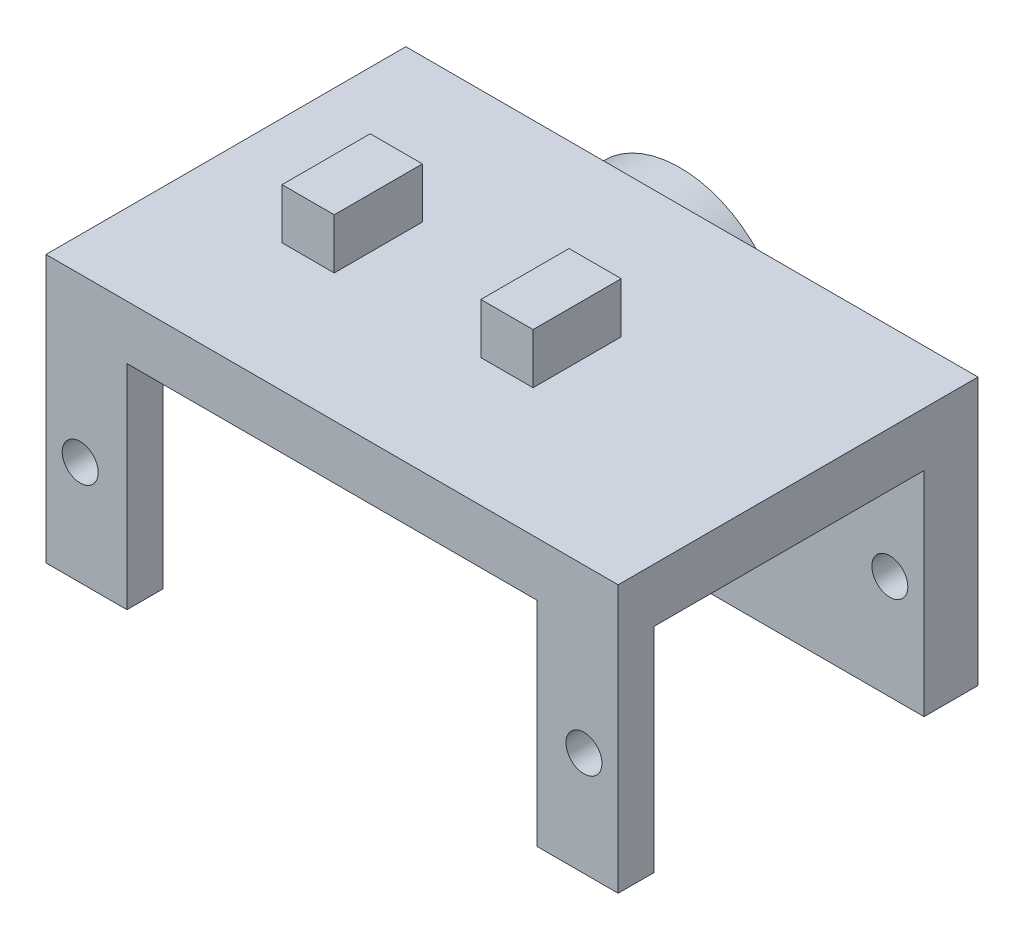
ISO-10303-21;
HEADER;
FILE_DESCRIPTION(('STEP AP214'),'2;1');
FILE_NAME('part.step','',(''),(''),'','','');
FILE_SCHEMA(('AUTOMOTIVE_DESIGN { 1 0 10303 214 1 1 1 1 }'));
ENDSEC;
DATA;
#1=APPLICATION_CONTEXT('core data for automotive mechanical design processes');
#2=APPLICATION_PROTOCOL_DEFINITION('international standard','automotive_design',2000,#1);
#3=PRODUCT_CONTEXT('',#1,'mechanical');
#4=PRODUCT('Part','Part','',(#3));
#5=PRODUCT_RELATED_PRODUCT_CATEGORY('part','',(#4));
#6=PRODUCT_DEFINITION_FORMATION('','',#4);
#7=PRODUCT_DEFINITION_CONTEXT('part definition',#1,'design');
#8=PRODUCT_DEFINITION('design','',#6,#7);
#9=PRODUCT_DEFINITION_SHAPE('','',#8);
#10=(LENGTH_UNIT() NAMED_UNIT(*) SI_UNIT(.MILLI.,.METRE.));
#11=(NAMED_UNIT(*) PLANE_ANGLE_UNIT() SI_UNIT($,.RADIAN.));
#12=(NAMED_UNIT(*) SI_UNIT($,.STERADIAN.) SOLID_ANGLE_UNIT());
#13=UNCERTAINTY_MEASURE_WITH_UNIT(LENGTH_MEASURE(1.E-05),#10,'distance_accuracy_value','');
#14=(GEOMETRIC_REPRESENTATION_CONTEXT(3) GLOBAL_UNCERTAINTY_ASSIGNED_CONTEXT((#13)) GLOBAL_UNIT_ASSIGNED_CONTEXT((#10,
#11,#12)) REPRESENTATION_CONTEXT('',''));
#15=CARTESIAN_POINT('',(0.,0.,0.));
#16=DIRECTION('',(0.,0.,1.));
#17=DIRECTION('',(1.,0.,0.));
#18=AXIS2_PLACEMENT_3D('',#15,#16,#17);
#19=CARTESIAN_POINT('',(-15.9,9.625,-21.));
#20=DIRECTION('',(0.,1.,0.));
#21=DIRECTION('',(0.,0.,1.));
#22=AXIS2_PLACEMENT_3D('',#19,#20,#21);
#23=PLANE('',#22);
#24=DIRECTION('',(-1.,0.,0.));
#25=VECTOR('',#24,1.);
#26=CARTESIAN_POINT('',(84.1,9.625,1.6));
#27=LINE('',#26,#25);
#28=CARTESIAN_POINT('',(15.9,9.625,1.6));
#29=VERTEX_POINT('',#28);
#30=CARTESIAN_POINT('',(-15.9,9.625,1.6));
#31=VERTEX_POINT('',#30);
#32=EDGE_CURVE('E297',#29,#31,#27,.T.);
#33=ORIENTED_EDGE('',*,*,#32,.F.);
#34=DIRECTION('',(0.,0.,1.));
#35=VECTOR('',#34,1.);
#36=CARTESIAN_POINT('',(15.9,9.625,-21.));
#37=LINE('',#36,#35);
#38=CARTESIAN_POINT('',(15.9,9.625,-18.4));
#39=VERTEX_POINT('',#38);
#40=EDGE_CURVE('E346',#39,#29,#37,.T.);
#41=ORIENTED_EDGE('',*,*,#40,.F.);
#42=DIRECTION('',(-1.,0.,0.));
#43=VECTOR('',#42,1.);
#44=CARTESIAN_POINT('',(-15.9,9.625,-18.4));
#45=LINE('',#44,#43);
#46=CARTESIAN_POINT('',(-15.9,9.625,-18.4));
#47=VERTEX_POINT('',#46);
#48=EDGE_CURVE('E322',#39,#47,#45,.T.);
#49=ORIENTED_EDGE('',*,*,#48,.T.);
#50=DIRECTION('',(0.,0.,1.));
#51=VECTOR('',#50,1.);
#52=CARTESIAN_POINT('',(-15.9,9.625,-21.));
#53=LINE('',#52,#51);
#54=EDGE_CURVE('E343',#47,#31,#53,.T.);
#55=ORIENTED_EDGE('',*,*,#54,.T.);
#56=EDGE_LOOP('',(#33,#41,#49,#55));
#57=FACE_BOUND('',#56,.T.);
#58=DIRECTION('',(-1.,0.,0.));
#59=VECTOR('',#58,1.);
#60=CARTESIAN_POINT('',(-9.9,9.625,-10.42));
#61=LINE('',#60,#59);
#62=CARTESIAN_POINT('',(-7.,9.625,-10.42));
#63=VERTEX_POINT('',#62);
#64=CARTESIAN_POINT('',(-9.9,9.625,-10.42));
#65=VERTEX_POINT('',#64);
#66=EDGE_CURVE('E207',#63,#65,#61,.T.);
#67=ORIENTED_EDGE('',*,*,#66,.F.);
#68=DIRECTION('',(0.,0.,-1.));
#69=VECTOR('',#68,1.);
#70=CARTESIAN_POINT('',(-7.,9.625,-10.42));
#71=LINE('',#70,#69);
#72=CARTESIAN_POINT('',(-7.,9.625,-5.52));
#73=VERTEX_POINT('',#72);
#74=EDGE_CURVE('E204',#73,#63,#71,.T.);
#75=ORIENTED_EDGE('',*,*,#74,.F.);
#76=DIRECTION('',(1.,0.,0.));
#77=VECTOR('',#76,1.);
#78=CARTESIAN_POINT('',(-9.9,9.625,-5.52));
#79=LINE('',#78,#77);
#80=CARTESIAN_POINT('',(-9.9,9.625,-5.52));
#81=VERTEX_POINT('',#80);
#82=EDGE_CURVE('E216',#81,#73,#79,.T.);
#83=ORIENTED_EDGE('',*,*,#82,.F.);
#84=DIRECTION('',(0.,0.,1.));
#85=VECTOR('',#84,1.);
#86=CARTESIAN_POINT('',(-9.9,9.625,-10.42));
#87=LINE('',#86,#85);
#88=EDGE_CURVE('E224',#65,#81,#87,.T.);
#89=ORIENTED_EDGE('',*,*,#88,.F.);
#90=EDGE_LOOP('',(#67,#75,#83,#89));
#91=FACE_BOUND('',#90,.T.);
#92=DIRECTION('',(-1.,0.,0.));
#93=VECTOR('',#92,1.);
#94=CARTESIAN_POINT('',(1.15,9.625,-10.42));
#95=LINE('',#94,#93);
#96=CARTESIAN_POINT('',(4.05,9.625,-10.42));
#97=VERTEX_POINT('',#96);
#98=CARTESIAN_POINT('',(1.15,9.625,-10.42));
#99=VERTEX_POINT('',#98);
#100=EDGE_CURVE('E647',#97,#99,#95,.T.);
#101=ORIENTED_EDGE('',*,*,#100,.F.);
#102=DIRECTION('',(0.,0.,-1.));
#103=VECTOR('',#102,1.);
#104=CARTESIAN_POINT('',(4.05,9.625,-5.52));
#105=LINE('',#104,#103);
#106=CARTESIAN_POINT('',(4.05,9.625,-5.52));
#107=VERTEX_POINT('',#106);
#108=EDGE_CURVE('E202',#107,#97,#105,.T.);
#109=ORIENTED_EDGE('',*,*,#108,.F.);
#110=DIRECTION('',(1.,0.,0.));
#111=VECTOR('',#110,1.);
#112=CARTESIAN_POINT('',(1.15,9.625,-5.52));
#113=LINE('',#112,#111);
#114=CARTESIAN_POINT('',(1.15,9.625,-5.52));
#115=VERTEX_POINT('',#114);
#116=EDGE_CURVE('E198',#115,#107,#113,.T.);
#117=ORIENTED_EDGE('',*,*,#116,.F.);
#118=DIRECTION('',(0.,0.,1.));
#119=VECTOR('',#118,1.);
#120=CARTESIAN_POINT('',(1.15,9.625,-5.52));
#121=LINE('',#120,#119);
#122=EDGE_CURVE('E644',#99,#115,#121,.T.);
#123=ORIENTED_EDGE('',*,*,#122,.F.);
#124=EDGE_LOOP('',(#101,#109,#117,#123));
#125=FACE_BOUND('',#124,.T.);
#126=ADVANCED_FACE('F37',(#57,#91,#125),#23,.T.);
#127=CARTESIAN_POINT('',(14.,0.574999999999999,-18.4));
#128=DIRECTION('',(0.,0.,1.));
#129=DIRECTION('',(1.,0.,0.));
#130=AXIS2_PLACEMENT_3D('',#127,#128,#129);
#131=CYLINDRICAL_SURFACE('',#130,1.);
#132=CARTESIAN_POINT('',(14.,0.574999999999999,-15.4));
#133=DIRECTION('',(0.,0.,1.));
#134=DIRECTION('',(1.,0.,0.));
#135=AXIS2_PLACEMENT_3D('',#132,#133,#134);
#136=CIRCLE('',#135,1.);
#137=CARTESIAN_POINT('',(15.,0.574999999999999,-15.4));
#138=VERTEX_POINT('',#137);
#139=EDGE_CURVE('E271',#138,#138,#136,.T.);
#140=ORIENTED_EDGE('',*,*,#139,.T.);
#141=EDGE_LOOP('',(#140));
#142=FACE_BOUND('',#141,.T.);
#143=CARTESIAN_POINT('',(14.,0.574999999999999,-18.4));
#144=DIRECTION('',(0.,0.,1.));
#145=DIRECTION('',(-1.,0.,0.));
#146=AXIS2_PLACEMENT_3D('',#143,#144,#145);
#147=CIRCLE('',#146,1.);
#148=CARTESIAN_POINT('',(13.,0.574999999999999,-18.4));
#149=VERTEX_POINT('',#148);
#150=EDGE_CURVE('E264',#149,#149,#147,.T.);
#151=ORIENTED_EDGE('',*,*,#150,.F.);
#152=EDGE_LOOP('',(#151));
#153=FACE_BOUND('',#152,.T.);
#154=ADVANCED_FACE('F430',(#142,#153),#131,.F.);
#155=CARTESIAN_POINT('',(11.4,0.,0.));
#156=DIRECTION('',(1.,0.,0.));
#157=DIRECTION('',(0.,0.,-1.));
#158=AXIS2_PLACEMENT_3D('',#155,#156,#157);
#159=PLANE('',#158);
#160=DIRECTION('',(0.,-1.,0.));
#161=VECTOR('',#160,1.);
#162=CARTESIAN_POINT('',(11.4,0.,-0.4));
#163=LINE('',#162,#161);
#164=CARTESIAN_POINT('',(11.4,6.625,-0.400000000000001));
#165=VERTEX_POINT('',#164);
#166=CARTESIAN_POINT('',(11.4,-5.225,-0.4));
#167=VERTEX_POINT('',#166);
#168=EDGE_CURVE('E319',#165,#167,#163,.T.);
#169=ORIENTED_EDGE('',*,*,#168,.T.);
#170=DIRECTION('',(0.,0.,1.));
#171=VECTOR('',#170,1.);
#172=CARTESIAN_POINT('',(11.4,-5.225,0.));
#173=LINE('',#172,#171);
#174=CARTESIAN_POINT('',(11.4,-5.225,1.6));
#175=VERTEX_POINT('',#174);
#176=EDGE_CURVE('E283',#167,#175,#173,.T.);
#177=ORIENTED_EDGE('',*,*,#176,.T.);
#178=DIRECTION('',(0.,1.,0.));
#179=VECTOR('',#178,1.);
#180=CARTESIAN_POINT('',(11.4,0.,1.6));
#181=LINE('',#180,#179);
#182=CARTESIAN_POINT('',(11.4,6.625,1.6));
#183=VERTEX_POINT('',#182);
#184=EDGE_CURVE('E309',#175,#183,#181,.T.);
#185=ORIENTED_EDGE('',*,*,#184,.T.);
#186=DIRECTION('',(0.,0.,1.));
#187=VECTOR('',#186,1.);
#188=CARTESIAN_POINT('',(11.4,6.625,0.));
#189=LINE('',#188,#187);
#190=EDGE_CURVE('E336',#165,#183,#189,.T.);
#191=ORIENTED_EDGE('',*,*,#190,.F.);
#192=EDGE_LOOP('',(#169,#177,#185,#191));
#193=FACE_BOUND('',#192,.T.);
#194=ADVANCED_FACE('F407',(#193),#159,.F.);
#195=CARTESIAN_POINT('',(-15.9,6.625,-21.));
#196=DIRECTION('',(0.,-1.,0.));
#197=DIRECTION('',(0.,0.,-1.));
#198=AXIS2_PLACEMENT_3D('',#195,#196,#197);
#199=PLANE('',#198);
#200=DIRECTION('',(-1.,0.,0.));
#201=VECTOR('',#200,1.);
#202=CARTESIAN_POINT('',(84.1,6.625,-0.400000000000001));
#203=LINE('',#202,#201);
#204=CARTESIAN_POINT('',(15.9,6.625,-0.400000000000001));
#205=VERTEX_POINT('',#204);
#206=EDGE_CURVE('E300',#205,#165,#203,.T.);
#207=ORIENTED_EDGE('',*,*,#206,.T.);
#208=ORIENTED_EDGE('',*,*,#190,.T.);
#209=DIRECTION('',(1.,0.,0.));
#210=VECTOR('',#209,1.);
#211=CARTESIAN_POINT('',(-15.9,6.625,1.6));
#212=LINE('',#211,#210);
#213=CARTESIAN_POINT('',(-11.4,6.625,1.6));
#214=VERTEX_POINT('',#213);
#215=EDGE_CURVE('E306',#214,#183,#212,.T.);
#216=ORIENTED_EDGE('',*,*,#215,.F.);
#217=DIRECTION('',(0.,0.,1.));
#218=VECTOR('',#217,1.);
#219=CARTESIAN_POINT('',(-11.4,6.625,0.));
#220=LINE('',#219,#218);
#221=CARTESIAN_POINT('',(-11.4,6.625,-0.400000000000001));
#222=VERTEX_POINT('',#221);
#223=EDGE_CURVE('E337',#222,#214,#220,.T.);
#224=ORIENTED_EDGE('',*,*,#223,.F.);
#225=CARTESIAN_POINT('',(-15.9,6.625,-0.400000000000001));
#226=VERTEX_POINT('',#225);
#227=EDGE_CURVE('E296',#222,#226,#203,.T.);
#228=ORIENTED_EDGE('',*,*,#227,.T.);
#229=DIRECTION('',(0.,0.,1.));
#230=VECTOR('',#229,1.);
#231=CARTESIAN_POINT('',(-15.9,6.625,-21.));
#232=LINE('',#231,#230);
#233=CARTESIAN_POINT('',(-15.9,6.625,-15.4));
#234=VERTEX_POINT('',#233);
#235=EDGE_CURVE('E340',#234,#226,#232,.T.);
#236=ORIENTED_EDGE('',*,*,#235,.F.);
#237=DIRECTION('',(-1.,0.,0.));
#238=VECTOR('',#237,1.);
#239=CARTESIAN_POINT('',(0.,6.625,-15.4));
#240=LINE('',#239,#238);
#241=CARTESIAN_POINT('',(15.9,6.625,-15.4));
#242=VERTEX_POINT('',#241);
#243=EDGE_CURVE('E333',#242,#234,#240,.T.);
#244=ORIENTED_EDGE('',*,*,#243,.F.);
#245=DIRECTION('',(0.,0.,1.));
#246=VECTOR('',#245,1.);
#247=CARTESIAN_POINT('',(15.9,6.625,-21.));
#248=LINE('',#247,#246);
#249=EDGE_CURVE('E349',#242,#205,#248,.T.);
#250=ORIENTED_EDGE('',*,*,#249,.T.);
#251=EDGE_LOOP('',(#207,#208,#216,#224,#228,#236,#244,#250));
#252=FACE_BOUND('',#251,.T.);
#253=ADVANCED_FACE('F362',(#252),#199,.T.);
#254=CARTESIAN_POINT('',(-15.9,-6.625,3.));
#255=DIRECTION('',(1.,0.,0.));
#256=DIRECTION('',(0.,0.,-1.));
#257=AXIS2_PLACEMENT_3D('',#254,#255,#256);
#258=PLANE('',#257);
#259=DIRECTION('',(0.,1.,0.));
#260=VECTOR('',#259,1.);
#261=CARTESIAN_POINT('',(-15.9,-39.8161959700948,-18.4));
#262=LINE('',#261,#260);
#263=CARTESIAN_POINT('',(-15.9,-5.225,-18.4));
#264=VERTEX_POINT('',#263);
#265=EDGE_CURVE('E326',#264,#47,#262,.T.);
#266=ORIENTED_EDGE('',*,*,#265,.F.);
#267=DIRECTION('',(0.,0.,1.));
#268=VECTOR('',#267,1.);
#269=CARTESIAN_POINT('',(-15.9,-5.225,-18.4));
#270=LINE('',#269,#268);
#271=CARTESIAN_POINT('',(-15.9,-5.225,-15.4));
#272=VERTEX_POINT('',#271);
#273=EDGE_CURVE('E252',#264,#272,#270,.T.);
#274=ORIENTED_EDGE('',*,*,#273,.T.);
#275=DIRECTION('',(0.,1.,0.));
#276=VECTOR('',#275,1.);
#277=CARTESIAN_POINT('',(-15.9,-39.8161959700948,-15.4));
#278=LINE('',#277,#276);
#279=EDGE_CURVE('E328',#272,#234,#278,.T.);
#280=ORIENTED_EDGE('',*,*,#279,.T.);
#281=ORIENTED_EDGE('',*,*,#235,.T.);
#282=DIRECTION('',(0.,1.,0.));
#283=VECTOR('',#282,1.);
#284=CARTESIAN_POINT('',(-15.9,6.625,-0.400000000000001));
#285=LINE('',#284,#283);
#286=CARTESIAN_POINT('',(-15.9,-5.225,-0.400000000000001));
#287=VERTEX_POINT('',#286);
#288=EDGE_CURVE('E294',#287,#226,#285,.T.);
#289=ORIENTED_EDGE('',*,*,#288,.F.);
#290=CARTESIAN_POINT('',(-15.9,-5.225,1.6));
#291=VERTEX_POINT('',#290);
#292=EDGE_CURVE('E256',#287,#291,#270,.T.);
#293=ORIENTED_EDGE('',*,*,#292,.T.);
#294=DIRECTION('',(0.,-1.,0.));
#295=VECTOR('',#294,1.);
#296=CARTESIAN_POINT('',(-15.9,9.625,1.6));
#297=LINE('',#296,#295);
#298=EDGE_CURVE('E293',#31,#291,#297,.T.);
#299=ORIENTED_EDGE('',*,*,#298,.F.);
#300=ORIENTED_EDGE('',*,*,#54,.F.);
#301=EDGE_LOOP('',(#266,#274,#280,#281,#289,#293,#299,#300));
#302=FACE_BOUND('',#301,.T.);
#303=ADVANCED_FACE('F39',(#302),#258,.F.);
#304=CARTESIAN_POINT('',(15.9,-6.625,3.));
#305=DIRECTION('',(-1.,0.,0.));
#306=DIRECTION('',(0.,0.,1.));
#307=AXIS2_PLACEMENT_3D('',#304,#305,#306);
#308=PLANE('',#307);
#309=DIRECTION('',(0.,-1.,0.));
#310=VECTOR('',#309,1.);
#311=CARTESIAN_POINT('',(15.9,-6.625,1.6));
#312=LINE('',#311,#310);
#313=CARTESIAN_POINT('',(15.9,-5.225,1.6));
#314=VERTEX_POINT('',#313);
#315=EDGE_CURVE('E311',#29,#314,#312,.T.);
#316=ORIENTED_EDGE('',*,*,#315,.T.);
#317=DIRECTION('',(0.,0.,1.));
#318=VECTOR('',#317,1.);
#319=CARTESIAN_POINT('',(15.9,-5.225,-18.4));
#320=LINE('',#319,#318);
#321=CARTESIAN_POINT('',(15.9,-5.225,-0.400000000000001));
#322=VERTEX_POINT('',#321);
#323=EDGE_CURVE('E247',#322,#314,#320,.T.);
#324=ORIENTED_EDGE('',*,*,#323,.F.);
#325=DIRECTION('',(0.,1.,0.));
#326=VECTOR('',#325,1.);
#327=CARTESIAN_POINT('',(15.9,-6.625,-0.399999999999999));
#328=LINE('',#327,#326);
#329=EDGE_CURVE('E317',#322,#205,#328,.T.);
#330=ORIENTED_EDGE('',*,*,#329,.T.);
#331=ORIENTED_EDGE('',*,*,#249,.F.);
#332=DIRECTION('',(0.,1.,0.));
#333=VECTOR('',#332,1.);
#334=CARTESIAN_POINT('',(15.9,-39.8161959700948,-15.4));
#335=LINE('',#334,#333);
#336=CARTESIAN_POINT('',(15.9,-5.225,-15.4));
#337=VERTEX_POINT('',#336);
#338=EDGE_CURVE('E325',#337,#242,#335,.T.);
#339=ORIENTED_EDGE('',*,*,#338,.F.);
#340=CARTESIAN_POINT('',(15.9,-5.225,-18.4));
#341=VERTEX_POINT('',#340);
#342=EDGE_CURVE('E257',#341,#337,#320,.T.);
#343=ORIENTED_EDGE('',*,*,#342,.F.);
#344=DIRECTION('',(0.,1.,0.));
#345=VECTOR('',#344,1.);
#346=CARTESIAN_POINT('',(15.9,-39.8161959700948,-18.4));
#347=LINE('',#346,#345);
#348=EDGE_CURVE('E329',#341,#39,#347,.T.);
#349=ORIENTED_EDGE('',*,*,#348,.T.);
#350=ORIENTED_EDGE('',*,*,#40,.T.);
#351=EDGE_LOOP('',(#316,#324,#330,#331,#339,#343,#349,#350));
#352=FACE_BOUND('',#351,.T.);
#353=ADVANCED_FACE('F399',(#352),#308,.F.);
#354=CARTESIAN_POINT('',(-11.4,0.,0.));
#355=DIRECTION('',(1.,0.,0.));
#356=DIRECTION('',(0.,0.,-1.));
#357=AXIS2_PLACEMENT_3D('',#354,#355,#356);
#358=PLANE('',#357);
#359=DIRECTION('',(0.,0.,1.));
#360=VECTOR('',#359,1.);
#361=CARTESIAN_POINT('',(-11.4,-5.225,0.));
#362=LINE('',#361,#360);
#363=CARTESIAN_POINT('',(-11.4,-5.225,-0.4));
#364=VERTEX_POINT('',#363);
#365=CARTESIAN_POINT('',(-11.4,-5.225,1.6));
#366=VERTEX_POINT('',#365);
#367=EDGE_CURVE('E289',#364,#366,#362,.T.);
#368=ORIENTED_EDGE('',*,*,#367,.F.);
#369=DIRECTION('',(0.,-1.,0.));
#370=VECTOR('',#369,1.);
#371=CARTESIAN_POINT('',(-11.4,0.,-0.4));
#372=LINE('',#371,#370);
#373=EDGE_CURVE('E314',#222,#364,#372,.T.);
#374=ORIENTED_EDGE('',*,*,#373,.F.);
#375=ORIENTED_EDGE('',*,*,#223,.T.);
#376=DIRECTION('',(0.,1.,0.));
#377=VECTOR('',#376,1.);
#378=CARTESIAN_POINT('',(-11.4,0.,1.6));
#379=LINE('',#378,#377);
#380=EDGE_CURVE('E304',#366,#214,#379,.T.);
#381=ORIENTED_EDGE('',*,*,#380,.F.);
#382=EDGE_LOOP('',(#368,#374,#375,#381));
#383=FACE_BOUND('',#382,.T.);
#384=ADVANCED_FACE('F369',(#383),#358,.T.);
#385=CARTESIAN_POINT('',(-15.9,-39.8161959700948,-15.4));
#386=DIRECTION('',(0.,0.,1.));
#387=DIRECTION('',(1.,0.,0.));
#388=AXIS2_PLACEMENT_3D('',#385,#386,#387);
#389=PLANE('',#388);
#390=DIRECTION('',(-1.,0.,0.));
#391=VECTOR('',#390,1.);
#392=CARTESIAN_POINT('',(-15.9,-5.225,-15.4));
#393=LINE('',#392,#391);
#394=EDGE_CURVE('E291',#337,#272,#393,.T.);
#395=ORIENTED_EDGE('',*,*,#394,.F.);
#396=ORIENTED_EDGE('',*,*,#338,.T.);
#397=ORIENTED_EDGE('',*,*,#243,.T.);
#398=ORIENTED_EDGE('',*,*,#279,.F.);
#399=EDGE_LOOP('',(#395,#396,#397,#398));
#400=FACE_BOUND('',#399,.T.);
#401=CARTESIAN_POINT('',(-14.,0.574999999999999,-15.4));
#402=DIRECTION('',(0.,0.,1.));
#403=DIRECTION('',(1.,0.,0.));
#404=AXIS2_PLACEMENT_3D('',#401,#402,#403);
#405=CIRCLE('',#404,1.);
#406=CARTESIAN_POINT('',(-13.,0.574999999999999,-15.4));
#407=VERTEX_POINT('',#406);
#408=EDGE_CURVE('E277',#407,#407,#405,.T.);
#409=ORIENTED_EDGE('',*,*,#408,.F.);
#410=EDGE_LOOP('',(#409));
#411=FACE_BOUND('',#410,.T.);
#412=ORIENTED_EDGE('',*,*,#139,.F.);
#413=EDGE_LOOP('',(#412));
#414=FACE_BOUND('',#413,.T.);
#415=ADVANCED_FACE('F393',(#400,#411,#414),#389,.T.);
#416=CARTESIAN_POINT('',(-15.9,-39.8161959700948,-18.4));
#417=DIRECTION('',(0.,0.,-1.));
#418=DIRECTION('',(-1.,0.,0.));
#419=AXIS2_PLACEMENT_3D('',#416,#417,#418);
#420=PLANE('',#419);
#421=DIRECTION('',(-1.,0.,0.));
#422=VECTOR('',#421,1.);
#423=CARTESIAN_POINT('',(-15.9,-5.225,-18.4));
#424=LINE('',#423,#422);
#425=CARTESIAN_POINT('',(-5.47000000000001,-5.225,-18.4));
#426=VERTEX_POINT('',#425);
#427=EDGE_CURVE('E245',#341,#426,#424,.T.);
#428=ORIENTED_EDGE('',*,*,#427,.T.);
#429=CARTESIAN_POINT('',(-5.47000000000001,0.699999999999999,-18.4));
#430=DIRECTION('',(0.,0.,-1.));
#431=DIRECTION('',(-1.,0.,0.));
#432=AXIS2_PLACEMENT_3D('',#429,#430,#431);
#433=CIRCLE('',#432,5.925);
#434=EDGE_CURVE('E237',#426,#426,#433,.T.);
#435=ORIENTED_EDGE('',*,*,#434,.F.);
#436=EDGE_CURVE('E248',#426,#264,#424,.T.);
#437=ORIENTED_EDGE('',*,*,#436,.T.);
#438=ORIENTED_EDGE('',*,*,#265,.T.);
#439=ORIENTED_EDGE('',*,*,#48,.F.);
#440=ORIENTED_EDGE('',*,*,#348,.F.);
#441=EDGE_LOOP('',(#428,#435,#437,#438,#439,#440));
#442=FACE_BOUND('',#441,.T.);
#443=CARTESIAN_POINT('',(-14.,0.574999999999999,-18.4));
#444=DIRECTION('',(0.,0.,1.));
#445=DIRECTION('',(1.,0.,0.));
#446=AXIS2_PLACEMENT_3D('',#443,#444,#445);
#447=CIRCLE('',#446,1.);
#448=CARTESIAN_POINT('',(-13.,0.574999999999999,-18.4));
#449=VERTEX_POINT('',#448);
#450=EDGE_CURVE('E251',#449,#449,#447,.T.);
#451=ORIENTED_EDGE('',*,*,#450,.T.);
#452=EDGE_LOOP('',(#451));
#453=FACE_BOUND('',#452,.T.);
#454=ORIENTED_EDGE('',*,*,#150,.T.);
#455=EDGE_LOOP('',(#454));
#456=FACE_BOUND('',#455,.T.);
#457=ADVANCED_FACE('F385',(#442,#453,#456),#420,.T.);
#458=CARTESIAN_POINT('',(84.1,6.625,-0.400000000000001));
#459=DIRECTION('',(0.,0.,1.));
#460=DIRECTION('',(0.,-1.,0.));
#461=AXIS2_PLACEMENT_3D('',#458,#459,#460);
#462=PLANE('',#461);
#463=CARTESIAN_POINT('',(-14.,0.574999999999999,-0.400000000000001));
#464=DIRECTION('',(0.,0.,1.));
#465=DIRECTION('',(0.,-1.,0.));
#466=AXIS2_PLACEMENT_3D('',#463,#464,#465);
#467=CIRCLE('',#466,1.);
#468=CARTESIAN_POINT('',(-14.,-0.425,-0.400000000000001));
#469=VERTEX_POINT('',#468);
#470=EDGE_CURVE('E274',#469,#469,#467,.T.);
#471=ORIENTED_EDGE('',*,*,#470,.T.);
#472=EDGE_LOOP('',(#471));
#473=FACE_BOUND('',#472,.T.);
#474=ORIENTED_EDGE('',*,*,#373,.T.);
#475=DIRECTION('',(-1.,0.,0.));
#476=VECTOR('',#475,1.);
#477=CARTESIAN_POINT('',(84.1,-5.225,-0.4));
#478=LINE('',#477,#476);
#479=EDGE_CURVE('E286',#364,#287,#478,.T.);
#480=ORIENTED_EDGE('',*,*,#479,.T.);
#481=ORIENTED_EDGE('',*,*,#288,.T.);
#482=ORIENTED_EDGE('',*,*,#227,.F.);
#483=EDGE_LOOP('',(#474,#480,#481,#482));
#484=FACE_BOUND('',#483,.T.);
#485=ADVANCED_FACE('F366',(#473,#484),#462,.F.);
#486=CARTESIAN_POINT('',(14.,0.574999999999999,-0.400000000000001));
#487=DIRECTION('',(0.,0.,1.));
#488=DIRECTION('',(0.,-1.,0.));
#489=AXIS2_PLACEMENT_3D('',#486,#487,#488);
#490=CIRCLE('',#489,1.);
#491=CARTESIAN_POINT('',(14.,-0.425,-0.400000000000001));
#492=VERTEX_POINT('',#491);
#493=EDGE_CURVE('E255',#492,#492,#490,.T.);
#494=ORIENTED_EDGE('',*,*,#493,.T.);
#495=EDGE_LOOP('',(#494));
#496=FACE_BOUND('',#495,.T.);
#497=ORIENTED_EDGE('',*,*,#329,.F.);
#498=DIRECTION('',(-1.,0.,0.));
#499=VECTOR('',#498,1.);
#500=CARTESIAN_POINT('',(84.1,-5.225,-0.4));
#501=LINE('',#500,#499);
#502=EDGE_CURVE('E280',#322,#167,#501,.T.);
#503=ORIENTED_EDGE('',*,*,#502,.T.);
#504=ORIENTED_EDGE('',*,*,#168,.F.);
#505=ORIENTED_EDGE('',*,*,#206,.F.);
#506=EDGE_LOOP('',(#497,#503,#504,#505));
#507=FACE_BOUND('',#506,.T.);
#508=ADVANCED_FACE('F404',(#496,#507),#462,.F.);
#509=CARTESIAN_POINT('',(84.1,9.625,1.6));
#510=DIRECTION('',(0.,0.,-1.));
#511=DIRECTION('',(0.,1.,0.));
#512=AXIS2_PLACEMENT_3D('',#509,#510,#511);
#513=PLANE('',#512);
#514=CARTESIAN_POINT('',(-14.,0.574999999999999,1.6));
#515=DIRECTION('',(0.,0.,1.));
#516=DIRECTION('',(1.,0.,0.));
#517=AXIS2_PLACEMENT_3D('',#514,#515,#516);
#518=CIRCLE('',#517,1.);
#519=CARTESIAN_POINT('',(-13.,0.574999999999999,1.6));
#520=VERTEX_POINT('',#519);
#521=EDGE_CURVE('E261',#520,#520,#518,.T.);
#522=ORIENTED_EDGE('',*,*,#521,.F.);
#523=EDGE_LOOP('',(#522));
#524=FACE_BOUND('',#523,.T.);
#525=CARTESIAN_POINT('',(14.,0.574999999999999,1.6));
#526=DIRECTION('',(0.,0.,1.));
#527=DIRECTION('',(-1.,0.,0.));
#528=AXIS2_PLACEMENT_3D('',#525,#526,#527);
#529=CIRCLE('',#528,1.);
#530=CARTESIAN_POINT('',(13.,0.574999999999999,1.6));
#531=VERTEX_POINT('',#530);
#532=EDGE_CURVE('E242',#531,#531,#529,.T.);
#533=ORIENTED_EDGE('',*,*,#532,.F.);
#534=EDGE_LOOP('',(#533));
#535=FACE_BOUND('',#534,.T.);
#536=ORIENTED_EDGE('',*,*,#298,.T.);
#537=DIRECTION('',(1.,0.,0.));
#538=VECTOR('',#537,1.);
#539=CARTESIAN_POINT('',(84.1,-5.225,1.6));
#540=LINE('',#539,#538);
#541=EDGE_CURVE('E41',#291,#366,#540,.T.);
#542=ORIENTED_EDGE('',*,*,#541,.T.);
#543=ORIENTED_EDGE('',*,*,#380,.T.);
#544=ORIENTED_EDGE('',*,*,#215,.T.);
#545=ORIENTED_EDGE('',*,*,#184,.F.);
#546=DIRECTION('',(-1.,0.,0.));
#547=VECTOR('',#546,1.);
#548=CARTESIAN_POINT('',(-15.9,-5.225,1.6));
#549=LINE('',#548,#547);
#550=EDGE_CURVE('E249',#314,#175,#549,.T.);
#551=ORIENTED_EDGE('',*,*,#550,.F.);
#552=ORIENTED_EDGE('',*,*,#315,.F.);
#553=ORIENTED_EDGE('',*,*,#32,.T.);
#554=EDGE_LOOP('',(#536,#542,#543,#544,#545,#551,#552,#553));
#555=FACE_BOUND('',#554,.T.);
#556=ADVANCED_FACE('F375',(#524,#535,#555),#513,.F.);
#557=ORIENTED_EDGE('',*,*,#532,.T.);
#558=EDGE_LOOP('',(#557));
#559=FACE_BOUND('',#558,.T.);
#560=ORIENTED_EDGE('',*,*,#493,.F.);
#561=EDGE_LOOP('',(#560));
#562=FACE_BOUND('',#561,.T.);
#563=ADVANCED_FACE('F437',(#559,#562),#131,.F.);
#564=CARTESIAN_POINT('',(-14.,0.574999999999999,-18.4));
#565=DIRECTION('',(0.,0.,1.));
#566=DIRECTION('',(1.,0.,0.));
#567=AXIS2_PLACEMENT_3D('',#564,#565,#566);
#568=CYLINDRICAL_SURFACE('',#567,1.);
#569=ORIENTED_EDGE('',*,*,#521,.T.);
#570=EDGE_LOOP('',(#569));
#571=FACE_BOUND('',#570,.T.);
#572=ORIENTED_EDGE('',*,*,#470,.F.);
#573=EDGE_LOOP('',(#572));
#574=FACE_BOUND('',#573,.T.);
#575=ADVANCED_FACE('F477',(#571,#574),#568,.F.);
#576=CARTESIAN_POINT('',(-15.9,-5.225,-18.4));
#577=DIRECTION('',(0.,1.,0.));
#578=DIRECTION('',(0.,0.,1.));
#579=AXIS2_PLACEMENT_3D('',#576,#577,#578);
#580=PLANE('',#579);
#581=ORIENTED_EDGE('',*,*,#502,.F.);
#582=ORIENTED_EDGE('',*,*,#323,.T.);
#583=ORIENTED_EDGE('',*,*,#550,.T.);
#584=ORIENTED_EDGE('',*,*,#176,.F.);
#585=EDGE_LOOP('',(#581,#582,#583,#584));
#586=FACE_BOUND('',#585,.T.);
#587=ADVANCED_FACE('F427',(#586),#580,.F.);
#588=ORIENTED_EDGE('',*,*,#367,.T.);
#589=ORIENTED_EDGE('',*,*,#541,.F.);
#590=ORIENTED_EDGE('',*,*,#292,.F.);
#591=ORIENTED_EDGE('',*,*,#479,.F.);
#592=EDGE_LOOP('',(#588,#589,#590,#591));
#593=FACE_BOUND('',#592,.T.);
#594=ADVANCED_FACE('F373',(#593),#580,.F.);
#595=ORIENTED_EDGE('',*,*,#408,.T.);
#596=EDGE_LOOP('',(#595));
#597=FACE_BOUND('',#596,.T.);
#598=ORIENTED_EDGE('',*,*,#450,.F.);
#599=EDGE_LOOP('',(#598));
#600=FACE_BOUND('',#599,.T.);
#601=ADVANCED_FACE('F425',(#597,#600),#568,.F.);
#602=ORIENTED_EDGE('',*,*,#394,.T.);
#603=ORIENTED_EDGE('',*,*,#273,.F.);
#604=ORIENTED_EDGE('',*,*,#436,.F.);
#605=ORIENTED_EDGE('',*,*,#427,.F.);
#606=ORIENTED_EDGE('',*,*,#342,.T.);
#607=EDGE_LOOP('',(#602,#603,#604,#605,#606));
#608=FACE_BOUND('',#607,.T.);
#609=ADVANCED_FACE('F411',(#608),#580,.F.);
#610=CARTESIAN_POINT('',(-5.47000000000001,0.699999999999999,-23.2));
#611=DIRECTION('',(0.,0.,1.));
#612=DIRECTION('',(1.,0.,0.));
#613=AXIS2_PLACEMENT_3D('',#610,#611,#612);
#614=CYLINDRICAL_SURFACE('',#613,5.925);
#615=CARTESIAN_POINT('',(-5.47000000000001,0.699999999999999,-23.2));
#616=DIRECTION('',(0.,0.,-1.));
#617=DIRECTION('',(-1.,0.,0.));
#618=AXIS2_PLACEMENT_3D('',#615,#616,#617);
#619=CIRCLE('',#618,5.925);
#620=CARTESIAN_POINT('',(-11.395,0.699999999999999,-23.2));
#621=VERTEX_POINT('',#620);
#622=EDGE_CURVE('E239',#621,#621,#619,.T.);
#623=ORIENTED_EDGE('',*,*,#622,.F.);
#624=EDGE_LOOP('',(#623));
#625=FACE_BOUND('',#624,.T.);
#626=ORIENTED_EDGE('',*,*,#434,.T.);
#627=EDGE_LOOP('',(#626));
#628=FACE_BOUND('',#627,.T.);
#629=ADVANCED_FACE('F413',(#625,#628),#614,.T.);
#630=CARTESIAN_POINT('',(-5.47000000000001,0.699999999999999,-23.2));
#631=DIRECTION('',(0.,0.,-1.));
#632=DIRECTION('',(-1.,0.,0.));
#633=AXIS2_PLACEMENT_3D('',#630,#631,#632);
#634=PLANE('',#633);
#635=CARTESIAN_POINT('',(-5.47000000000001,0.699999999999999,-23.2));
#636=DIRECTION('',(0.,0.,-1.));
#637=DIRECTION('',(-1.,0.,0.));
#638=AXIS2_PLACEMENT_3D('',#635,#636,#637);
#639=CIRCLE('',#638,2.5);
#640=CARTESIAN_POINT('',(-7.97000000000001,0.699999999999999,-23.2));
#641=VERTEX_POINT('',#640);
#642=EDGE_CURVE('E11',#641,#641,#639,.T.);
#643=ORIENTED_EDGE('',*,*,#642,.F.);
#644=EDGE_LOOP('',(#643));
#645=FACE_BOUND('',#644,.T.);
#646=ORIENTED_EDGE('',*,*,#622,.T.);
#647=EDGE_LOOP('',(#646));
#648=FACE_BOUND('',#647,.T.);
#649=ADVANCED_FACE('F415',(#645,#648),#634,.T.);
#650=CARTESIAN_POINT('',(-5.47000000000001,0.699999999999999,-25.2));
#651=DIRECTION('',(0.,0.,1.));
#652=DIRECTION('',(1.,0.,0.));
#653=AXIS2_PLACEMENT_3D('',#650,#651,#652);
#654=CYLINDRICAL_SURFACE('',#653,2.5);
#655=CARTESIAN_POINT('',(-5.47000000000001,0.699999999999999,-25.2));
#656=DIRECTION('',(0.,0.,-1.));
#657=DIRECTION('',(-1.,0.,0.));
#658=AXIS2_PLACEMENT_3D('',#655,#656,#657);
#659=CIRCLE('',#658,2.5);
#660=CARTESIAN_POINT('',(-7.97000000000001,0.699999999999999,-25.2));
#661=VERTEX_POINT('',#660);
#662=EDGE_CURVE('E235',#661,#661,#659,.T.);
#663=ORIENTED_EDGE('',*,*,#662,.F.);
#664=EDGE_LOOP('',(#663));
#665=FACE_BOUND('',#664,.T.);
#666=ORIENTED_EDGE('',*,*,#642,.T.);
#667=EDGE_LOOP('',(#666));
#668=FACE_BOUND('',#667,.T.);
#669=ADVANCED_FACE('F422',(#665,#668),#654,.T.);
#670=CARTESIAN_POINT('',(-5.47000000000001,0.699999999999999,-25.2));
#671=DIRECTION('',(0.,0.,-1.));
#672=DIRECTION('',(-1.,0.,0.));
#673=AXIS2_PLACEMENT_3D('',#670,#671,#672);
#674=PLANE('',#673);
#675=ORIENTED_EDGE('',*,*,#662,.T.);
#676=EDGE_LOOP('',(#675));
#677=FACE_BOUND('',#676,.T.);
#678=ADVANCED_FACE('F527',(#677),#674,.T.);
#679=CARTESIAN_POINT('',(-7.,12.425,-10.42));
#680=DIRECTION('',(-1.,0.,0.));
#681=DIRECTION('',(0.,0.,1.));
#682=AXIS2_PLACEMENT_3D('',#679,#680,#681);
#683=PLANE('',#682);
#684=ORIENTED_EDGE('',*,*,#74,.T.);
#685=DIRECTION('',(0.,-1.,0.));
#686=VECTOR('',#685,1.);
#687=CARTESIAN_POINT('',(-7.,12.425,-10.42));
#688=LINE('',#687,#686);
#689=CARTESIAN_POINT('',(-7.,12.425,-10.42));
#690=VERTEX_POINT('',#689);
#691=EDGE_CURVE('E233',#690,#63,#688,.T.);
#692=ORIENTED_EDGE('',*,*,#691,.F.);
#693=DIRECTION('',(0.,0.,-1.));
#694=VECTOR('',#693,1.);
#695=CARTESIAN_POINT('',(-7.,12.425,-10.42));
#696=LINE('',#695,#694);
#697=CARTESIAN_POINT('',(-7.,12.425,-5.52));
#698=VERTEX_POINT('',#697);
#699=EDGE_CURVE('E212',#698,#690,#696,.T.);
#700=ORIENTED_EDGE('',*,*,#699,.F.);
#701=DIRECTION('',(0.,-1.,0.));
#702=VECTOR('',#701,1.);
#703=CARTESIAN_POINT('',(-7.,12.425,-5.52));
#704=LINE('',#703,#702);
#705=EDGE_CURVE('E221',#698,#73,#704,.T.);
#706=ORIENTED_EDGE('',*,*,#705,.T.);
#707=EDGE_LOOP('',(#684,#692,#700,#706));
#708=FACE_BOUND('',#707,.T.);
#709=ADVANCED_FACE('F536',(#708),#683,.F.);
#710=CARTESIAN_POINT('',(-9.9,12.425,-10.42));
#711=DIRECTION('',(0.,0.,1.));
#712=DIRECTION('',(1.,0.,0.));
#713=AXIS2_PLACEMENT_3D('',#710,#711,#712);
#714=PLANE('',#713);
#715=ORIENTED_EDGE('',*,*,#66,.T.);
#716=DIRECTION('',(0.,-1.,0.));
#717=VECTOR('',#716,1.);
#718=CARTESIAN_POINT('',(-9.9,12.425,-10.42));
#719=LINE('',#718,#717);
#720=CARTESIAN_POINT('',(-9.9,12.425,-10.42));
#721=VERTEX_POINT('',#720);
#722=EDGE_CURVE('E230',#721,#65,#719,.T.);
#723=ORIENTED_EDGE('',*,*,#722,.F.);
#724=DIRECTION('',(-1.,0.,0.));
#725=VECTOR('',#724,1.);
#726=CARTESIAN_POINT('',(-9.9,12.425,-10.42));
#727=LINE('',#726,#725);
#728=EDGE_CURVE('E215',#690,#721,#727,.T.);
#729=ORIENTED_EDGE('',*,*,#728,.F.);
#730=ORIENTED_EDGE('',*,*,#691,.T.);
#731=EDGE_LOOP('',(#715,#723,#729,#730));
#732=FACE_BOUND('',#731,.T.);
#733=ADVANCED_FACE('F552',(#732),#714,.F.);
#734=CARTESIAN_POINT('',(-9.9,12.425,-10.42));
#735=DIRECTION('',(1.,0.,0.));
#736=DIRECTION('',(0.,0.,-1.));
#737=AXIS2_PLACEMENT_3D('',#734,#735,#736);
#738=PLANE('',#737);
#739=ORIENTED_EDGE('',*,*,#88,.T.);
#740=DIRECTION('',(0.,-1.,0.));
#741=VECTOR('',#740,1.);
#742=CARTESIAN_POINT('',(-9.9,12.425,-5.52));
#743=LINE('',#742,#741);
#744=CARTESIAN_POINT('',(-9.9,12.425,-5.52));
#745=VERTEX_POINT('',#744);
#746=EDGE_CURVE('E61',#745,#81,#743,.T.);
#747=ORIENTED_EDGE('',*,*,#746,.F.);
#748=DIRECTION('',(0.,0.,1.));
#749=VECTOR('',#748,1.);
#750=CARTESIAN_POINT('',(-9.9,12.425,-10.42));
#751=LINE('',#750,#749);
#752=EDGE_CURVE('E218',#721,#745,#751,.T.);
#753=ORIENTED_EDGE('',*,*,#752,.F.);
#754=ORIENTED_EDGE('',*,*,#722,.T.);
#755=EDGE_LOOP('',(#739,#747,#753,#754));
#756=FACE_BOUND('',#755,.T.);
#757=ADVANCED_FACE('F561',(#756),#738,.F.);
#758=CARTESIAN_POINT('',(-9.9,12.425,-5.52));
#759=DIRECTION('',(0.,0.,-1.));
#760=DIRECTION('',(-1.,0.,0.));
#761=AXIS2_PLACEMENT_3D('',#758,#759,#760);
#762=PLANE('',#761);
#763=ORIENTED_EDGE('',*,*,#82,.T.);
#764=ORIENTED_EDGE('',*,*,#705,.F.);
#765=DIRECTION('',(1.,0.,0.));
#766=VECTOR('',#765,1.);
#767=CARTESIAN_POINT('',(-9.9,12.425,-5.52));
#768=LINE('',#767,#766);
#769=EDGE_CURVE('E220',#745,#698,#768,.T.);
#770=ORIENTED_EDGE('',*,*,#769,.F.);
#771=ORIENTED_EDGE('',*,*,#746,.T.);
#772=EDGE_LOOP('',(#763,#764,#770,#771));
#773=FACE_BOUND('',#772,.T.);
#774=ADVANCED_FACE('F570',(#773),#762,.F.);
#775=CARTESIAN_POINT('',(0.,12.425,0.));
#776=DIRECTION('',(0.,1.,0.));
#777=DIRECTION('',(0.,0.,1.));
#778=AXIS2_PLACEMENT_3D('',#775,#776,#777);
#779=PLANE('',#778);
#780=ORIENTED_EDGE('',*,*,#699,.T.);
#781=ORIENTED_EDGE('',*,*,#728,.T.);
#782=ORIENTED_EDGE('',*,*,#752,.T.);
#783=ORIENTED_EDGE('',*,*,#769,.T.);
#784=EDGE_LOOP('',(#780,#781,#782,#783));
#785=FACE_BOUND('',#784,.T.);
#786=ADVANCED_FACE('F579',(#785),#779,.T.);
#787=CARTESIAN_POINT('',(4.05,12.425,-5.52));
#788=DIRECTION('',(-1.,0.,0.));
#789=DIRECTION('',(0.,0.,1.));
#790=AXIS2_PLACEMENT_3D('',#787,#788,#789);
#791=PLANE('',#790);
#792=ORIENTED_EDGE('',*,*,#108,.T.);
#793=DIRECTION('',(0.,-1.,0.));
#794=VECTOR('',#793,1.);
#795=CARTESIAN_POINT('',(4.05,12.425,-10.42));
#796=LINE('',#795,#794);
#797=CARTESIAN_POINT('',(4.05,12.425,-10.42));
#798=VERTEX_POINT('',#797);
#799=EDGE_CURVE('E183',#798,#97,#796,.T.);
#800=ORIENTED_EDGE('',*,*,#799,.F.);
#801=DIRECTION('',(0.,0.,-1.));
#802=VECTOR('',#801,1.);
#803=CARTESIAN_POINT('',(4.05,12.425,-5.52));
#804=LINE('',#803,#802);
#805=CARTESIAN_POINT('',(4.05,12.425,-5.52));
#806=VERTEX_POINT('',#805);
#807=EDGE_CURVE('E190',#806,#798,#804,.T.);
#808=ORIENTED_EDGE('',*,*,#807,.F.);
#809=DIRECTION('',(0.,-1.,0.));
#810=VECTOR('',#809,1.);
#811=CARTESIAN_POINT('',(4.05,12.425,-5.52));
#812=LINE('',#811,#810);
#813=EDGE_CURVE('E641',#806,#107,#812,.T.);
#814=ORIENTED_EDGE('',*,*,#813,.T.);
#815=EDGE_LOOP('',(#792,#800,#808,#814));
#816=FACE_BOUND('',#815,.T.);
#817=ADVANCED_FACE('F200',(#816),#791,.F.);
#818=CARTESIAN_POINT('',(1.15,12.425,-10.42));
#819=DIRECTION('',(0.,0.,1.));
#820=DIRECTION('',(1.,0.,0.));
#821=AXIS2_PLACEMENT_3D('',#818,#819,#820);
#822=PLANE('',#821);
#823=ORIENTED_EDGE('',*,*,#100,.T.);
#824=DIRECTION('',(0.,-1.,0.));
#825=VECTOR('',#824,1.);
#826=CARTESIAN_POINT('',(1.15,12.425,-10.42));
#827=LINE('',#826,#825);
#828=CARTESIAN_POINT('',(1.15,12.425,-10.42));
#829=VERTEX_POINT('',#828);
#830=EDGE_CURVE('E186',#829,#99,#827,.T.);
#831=ORIENTED_EDGE('',*,*,#830,.F.);
#832=DIRECTION('',(-1.,0.,0.));
#833=VECTOR('',#832,1.);
#834=CARTESIAN_POINT('',(1.15,12.425,-10.42));
#835=LINE('',#834,#833);
#836=EDGE_CURVE('E179',#798,#829,#835,.T.);
#837=ORIENTED_EDGE('',*,*,#836,.F.);
#838=ORIENTED_EDGE('',*,*,#799,.T.);
#839=EDGE_LOOP('',(#823,#831,#837,#838));
#840=FACE_BOUND('',#839,.T.);
#841=ADVANCED_FACE('F181',(#840),#822,.F.);
#842=CARTESIAN_POINT('',(1.15,12.425,-5.52));
#843=DIRECTION('',(1.,0.,0.));
#844=DIRECTION('',(0.,0.,-1.));
#845=AXIS2_PLACEMENT_3D('',#842,#843,#844);
#846=PLANE('',#845);
#847=ORIENTED_EDGE('',*,*,#122,.T.);
#848=DIRECTION('',(0.,-1.,0.));
#849=VECTOR('',#848,1.);
#850=CARTESIAN_POINT('',(1.15,12.425,-5.52));
#851=LINE('',#850,#849);
#852=CARTESIAN_POINT('',(1.15,12.425,-5.52));
#853=VERTEX_POINT('',#852);
#854=EDGE_CURVE('E53',#853,#115,#851,.T.);
#855=ORIENTED_EDGE('',*,*,#854,.F.);
#856=DIRECTION('',(0.,0.,1.));
#857=VECTOR('',#856,1.);
#858=CARTESIAN_POINT('',(1.15,12.425,-5.52));
#859=LINE('',#858,#857);
#860=EDGE_CURVE('E189',#829,#853,#859,.T.);
#861=ORIENTED_EDGE('',*,*,#860,.F.);
#862=ORIENTED_EDGE('',*,*,#830,.T.);
#863=EDGE_LOOP('',(#847,#855,#861,#862));
#864=FACE_BOUND('',#863,.T.);
#865=ADVANCED_FACE('F602',(#864),#846,.F.);
#866=CARTESIAN_POINT('',(1.15,12.425,-5.52));
#867=DIRECTION('',(0.,0.,-1.));
#868=DIRECTION('',(-1.,0.,0.));
#869=AXIS2_PLACEMENT_3D('',#866,#867,#868);
#870=PLANE('',#869);
#871=ORIENTED_EDGE('',*,*,#116,.T.);
#872=ORIENTED_EDGE('',*,*,#813,.F.);
#873=DIRECTION('',(1.,0.,0.));
#874=VECTOR('',#873,1.);
#875=CARTESIAN_POINT('',(1.15,12.425,-5.52));
#876=LINE('',#875,#874);
#877=EDGE_CURVE('E194',#853,#806,#876,.T.);
#878=ORIENTED_EDGE('',*,*,#877,.F.);
#879=ORIENTED_EDGE('',*,*,#854,.T.);
#880=EDGE_LOOP('',(#871,#872,#878,#879));
#881=FACE_BOUND('',#880,.T.);
#882=ADVANCED_FACE('F610',(#881),#870,.F.);
#883=CARTESIAN_POINT('',(0.,12.425,0.));
#884=DIRECTION('',(0.,-1.,0.));
#885=DIRECTION('',(0.,0.,-1.));
#886=AXIS2_PLACEMENT_3D('',#883,#884,#885);
#887=PLANE('',#886);
#888=ORIENTED_EDGE('',*,*,#807,.T.);
#889=ORIENTED_EDGE('',*,*,#836,.T.);
#890=ORIENTED_EDGE('',*,*,#860,.T.);
#891=ORIENTED_EDGE('',*,*,#877,.T.);
#892=EDGE_LOOP('',(#888,#889,#890,#891));
#893=FACE_BOUND('',#892,.T.);
#894=ADVANCED_FACE('F193',(#893),#887,.F.);
#895=CLOSED_SHELL('',(#126,#154,#194,#253,#303,#353,#384,#415,#457,#485,#508,#556,#563,#575,
#587,#594,#601,#609,#629,#649,#669,#678,#709,#733,#757,#774,#786,#817,#841,#865,#882,#894));
#896=MANIFOLD_SOLID_BREP('B2',#895);
#897=ADVANCED_BREP_SHAPE_REPRESENTATION('',(#18,#896),#14);
#898=SHAPE_DEFINITION_REPRESENTATION(#9,#897);
ENDSEC;
END-ISO-10303-21;
